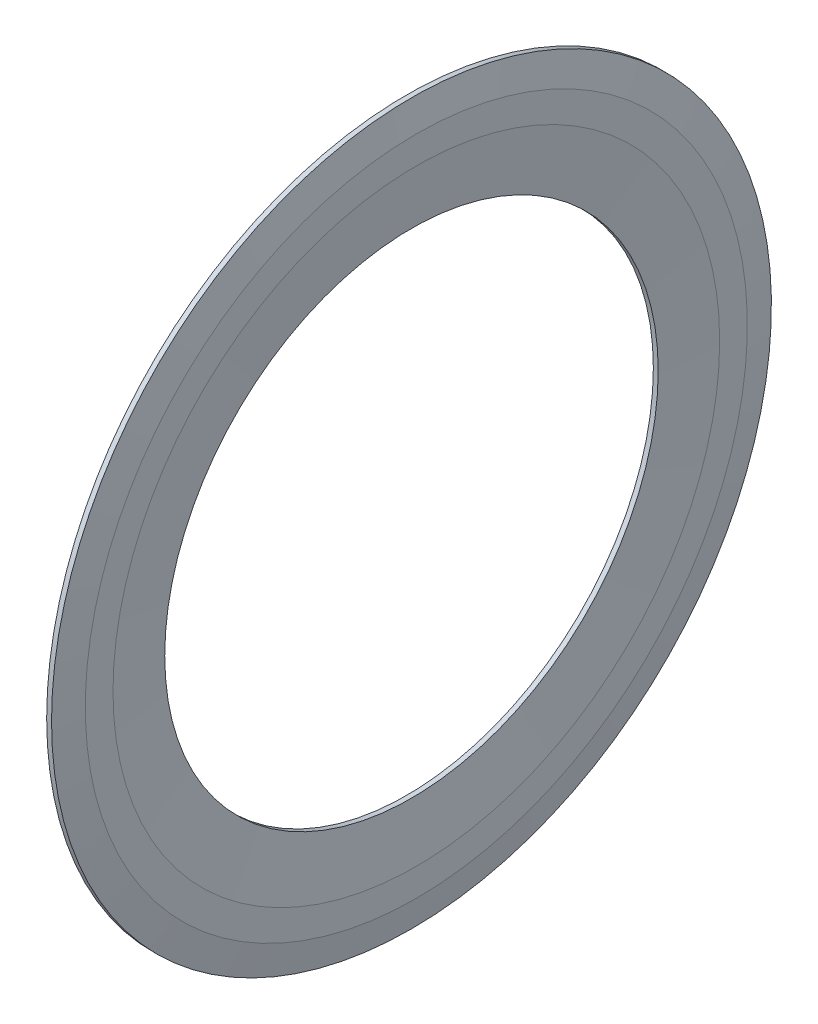
ISO-10303-21;
HEADER;
FILE_DESCRIPTION(('STEP AP214'),'2;1');
FILE_NAME('part.step','',(''),(''),'','','');
FILE_SCHEMA(('AUTOMOTIVE_DESIGN { 1 0 10303 214 1 1 1 1 }'));
ENDSEC;
DATA;
#1=APPLICATION_CONTEXT('core data for automotive mechanical design processes');
#2=APPLICATION_PROTOCOL_DEFINITION('international standard','automotive_design',2000,#1);
#3=PRODUCT_CONTEXT('',#1,'mechanical');
#4=PRODUCT('Part','Part','',(#3));
#5=PRODUCT_RELATED_PRODUCT_CATEGORY('part','',(#4));
#6=PRODUCT_DEFINITION_FORMATION('','',#4);
#7=PRODUCT_DEFINITION_CONTEXT('part definition',#1,'design');
#8=PRODUCT_DEFINITION('design','',#6,#7);
#9=PRODUCT_DEFINITION_SHAPE('','',#8);
#10=(LENGTH_UNIT() NAMED_UNIT(*) SI_UNIT(.MILLI.,.METRE.));
#11=(NAMED_UNIT(*) PLANE_ANGLE_UNIT() SI_UNIT($,.RADIAN.));
#12=(NAMED_UNIT(*) SI_UNIT($,.STERADIAN.) SOLID_ANGLE_UNIT());
#13=UNCERTAINTY_MEASURE_WITH_UNIT(LENGTH_MEASURE(1.E-05),#10,'distance_accuracy_value','');
#14=(GEOMETRIC_REPRESENTATION_CONTEXT(3) GLOBAL_UNCERTAINTY_ASSIGNED_CONTEXT((#13)) GLOBAL_UNIT_ASSIGNED_CONTEXT((#10,
#11,#12)) REPRESENTATION_CONTEXT('',''));
#15=CARTESIAN_POINT('',(0.,0.,0.));
#16=DIRECTION('',(0.,0.,1.));
#17=DIRECTION('',(1.,0.,0.));
#18=AXIS2_PLACEMENT_3D('',#15,#16,#17);
#19=CARTESIAN_POINT('',(0.502281,0.,0.));
#20=DIRECTION('',(-1.,0.,0.));
#21=DIRECTION('',(0.,0.,1.));
#22=AXIS2_PLACEMENT_3D('',#19,#20,#21);
#23=CONICAL_SURFACE('',#22,12.4,1.48513467482621);
#24=CARTESIAN_POINT('',(0.502281,0.,0.));
#25=DIRECTION('',(-1.,0.,0.));
#26=DIRECTION('',(0.,0.,1.));
#27=AXIS2_PLACEMENT_3D('',#24,#25,#26);
#28=CIRCLE('',#27,12.4);
#29=CARTESIAN_POINT('',(0.502281,0.,12.4));
#30=VERTEX_POINT('',#29);
#31=EDGE_CURVE('E40',#30,#30,#28,.F.);
#32=ORIENTED_EDGE('',*,*,#31,.F.);
#33=EDGE_LOOP('',(#32));
#34=FACE_BOUND('',#33,.T.);
#35=CARTESIAN_POINT('',(0.586006,0.,0.));
#36=DIRECTION('',(1.,0.,0.));
#37=DIRECTION('',(0.,0.,-1.));
#38=AXIS2_PLACEMENT_3D('',#35,#36,#37);
#39=CIRCLE('',#38,11.425);
#40=CARTESIAN_POINT('',(0.586006,0.,-11.425));
#41=VERTEX_POINT('',#40);
#42=EDGE_CURVE('E35',#41,#41,#39,.F.);
#43=ORIENTED_EDGE('',*,*,#42,.F.);
#44=EDGE_LOOP('',(#43));
#45=FACE_BOUND('',#44,.T.);
#46=ADVANCED_FACE('F15',(#34,#45),#23,.F.);
#47=CARTESIAN_POINT('',(0.669731,0.,0.));
#48=DIRECTION('',(-1.,0.,0.));
#49=DIRECTION('',(0.,0.,1.));
#50=AXIS2_PLACEMENT_3D('',#47,#48,#49);
#51=CYLINDRICAL_SURFACE('',#50,12.4);
#52=CARTESIAN_POINT('',(0.669731000000009,0.,0.));
#53=DIRECTION('',(-1.,0.,0.));
#54=DIRECTION('',(0.,0.,1.));
#55=AXIS2_PLACEMENT_3D('',#52,#53,#54);
#56=CIRCLE('',#55,12.4);
#57=CARTESIAN_POINT('',(0.669731000000009,0.,12.4));
#58=VERTEX_POINT('',#57);
#59=EDGE_CURVE('E32',#58,#58,#56,.F.);
#60=ORIENTED_EDGE('',*,*,#59,.F.);
#61=EDGE_LOOP('',(#60));
#62=FACE_BOUND('',#61,.T.);
#63=ORIENTED_EDGE('',*,*,#31,.T.);
#64=EDGE_LOOP('',(#63));
#65=FACE_BOUND('',#64,.T.);
#66=ADVANCED_FACE('F61',(#62,#65),#51,.T.);
#67=CARTESIAN_POINT('',(0.586006,0.,0.));
#68=DIRECTION('',(1.,0.,0.));
#69=DIRECTION('',(0.,0.,-1.));
#70=AXIS2_PLACEMENT_3D('',#67,#68,#69);
#71=CONICAL_SURFACE('',#70,11.425,1.48513467482621);
#72=ORIENTED_EDGE('',*,*,#42,.T.);
#73=EDGE_LOOP('',(#72));
#74=FACE_BOUND('',#73,.T.);
#75=CARTESIAN_POINT('',(0.502280999999997,0.,0.));
#76=DIRECTION('',(1.,0.,0.));
#77=DIRECTION('',(0.,0.,-1.));
#78=AXIS2_PLACEMENT_3D('',#75,#76,#77);
#79=CIRCLE('',#78,10.45);
#80=CARTESIAN_POINT('',(0.502280999999997,0.,-10.45));
#81=VERTEX_POINT('',#80);
#82=EDGE_CURVE('E18',#81,#81,#79,.F.);
#83=ORIENTED_EDGE('',*,*,#82,.F.);
#84=EDGE_LOOP('',(#83));
#85=FACE_BOUND('',#84,.T.);
#86=ADVANCED_FACE('F58',(#74,#85),#71,.T.);
#87=CARTESIAN_POINT('',(0.669731000000008,0.,0.));
#88=DIRECTION('',(-1.,0.,0.));
#89=DIRECTION('',(0.,-1.,0.));
#90=AXIS2_PLACEMENT_3D('',#87,#88,#89);
#91=CONICAL_SURFACE('',#90,12.4,1.40432483690449);
#92=CARTESIAN_POINT('',(0.837181,0.,0.));
#93=DIRECTION('',(-1.,0.,0.));
#94=DIRECTION('',(0.,-1.,0.));
#95=AXIS2_PLACEMENT_3D('',#92,#93,#94);
#96=CIRCLE('',#95,11.4034311519231);
#97=CARTESIAN_POINT('',(0.837181,-11.4034311519231,0.));
#98=VERTEX_POINT('',#97);
#99=EDGE_CURVE('E48',#98,#98,#96,.F.);
#100=ORIENTED_EDGE('',*,*,#99,.F.);
#101=EDGE_LOOP('',(#100));
#102=FACE_BOUND('',#101,.T.);
#103=ORIENTED_EDGE('',*,*,#59,.T.);
#104=EDGE_LOOP('',(#103));
#105=FACE_BOUND('',#104,.T.);
#106=ADVANCED_FACE('F60',(#102,#105),#91,.T.);
#107=CARTESIAN_POINT('',(0.502281,10.45,0.));
#108=DIRECTION('',(-1.,0.,0.));
#109=DIRECTION('',(0.,0.,1.));
#110=AXIS2_PLACEMENT_3D('',#107,#108,#109);
#111=PLANE('',#110);
#112=ORIENTED_EDGE('',*,*,#82,.T.);
#113=EDGE_LOOP('',(#112));
#114=FACE_BOUND('',#113,.T.);
#115=CARTESIAN_POINT('',(0.502281,0.,0.));
#116=DIRECTION('',(-1.,0.,0.));
#117=DIRECTION('',(0.,0.,1.));
#118=AXIS2_PLACEMENT_3D('',#115,#116,#117);
#119=CIRCLE('',#118,8.5);
#120=CARTESIAN_POINT('',(0.502281,0.,8.5));
#121=VERTEX_POINT('',#120);
#122=EDGE_CURVE('E27',#121,#121,#119,.F.);
#123=ORIENTED_EDGE('',*,*,#122,.T.);
#124=EDGE_LOOP('',(#123));
#125=FACE_BOUND('',#124,.T.);
#126=ADVANCED_FACE('F55',(#114,#125),#111,.T.);
#127=CARTESIAN_POINT('',(0.837181,10.45,0.));
#128=DIRECTION('',(1.,0.,0.));
#129=DIRECTION('',(0.,0.,-1.));
#130=AXIS2_PLACEMENT_3D('',#127,#128,#129);
#131=PLANE('',#130);
#132=CARTESIAN_POINT('',(0.837181000000006,0.,0.));
#133=DIRECTION('',(1.,0.,0.));
#134=DIRECTION('',(0.,0.,-1.));
#135=AXIS2_PLACEMENT_3D('',#132,#133,#134);
#136=CIRCLE('',#135,10.45);
#137=CARTESIAN_POINT('',(0.837181000000006,0.,-10.45));
#138=VERTEX_POINT('',#137);
#139=EDGE_CURVE('E22',#138,#138,#136,.F.);
#140=ORIENTED_EDGE('',*,*,#139,.T.);
#141=EDGE_LOOP('',(#140));
#142=FACE_BOUND('',#141,.T.);
#143=ORIENTED_EDGE('',*,*,#99,.T.);
#144=EDGE_LOOP('',(#143));
#145=FACE_BOUND('',#144,.T.);
#146=ADVANCED_FACE('F80',(#142,#145),#131,.T.);
#147=CARTESIAN_POINT('',(0.669731,0.,0.));
#148=DIRECTION('',(-1.,0.,0.));
#149=DIRECTION('',(0.,0.,1.));
#150=AXIS2_PLACEMENT_3D('',#147,#148,#149);
#151=CYLINDRICAL_SURFACE('',#150,8.5);
#152=ORIENTED_EDGE('',*,*,#122,.F.);
#153=EDGE_LOOP('',(#152));
#154=FACE_BOUND('',#153,.T.);
#155=CARTESIAN_POINT('',(0.669731,0.,0.));
#156=DIRECTION('',(1.,0.,0.));
#157=DIRECTION('',(0.,0.,-1.));
#158=AXIS2_PLACEMENT_3D('',#155,#156,#157);
#159=CIRCLE('',#158,8.5);
#160=CARTESIAN_POINT('',(0.669731,0.,-8.5));
#161=VERTEX_POINT('',#160);
#162=EDGE_CURVE('E10',#161,#161,#159,.T.);
#163=ORIENTED_EDGE('',*,*,#162,.T.);
#164=EDGE_LOOP('',(#163));
#165=FACE_BOUND('',#164,.T.);
#166=ADVANCED_FACE('F74',(#154,#165),#151,.F.);
#167=CARTESIAN_POINT('',(0.837181000000006,0.,0.));
#168=DIRECTION('',(1.,0.,0.));
#169=DIRECTION('',(0.,0.,-1.));
#170=AXIS2_PLACEMENT_3D('',#167,#168,#169);
#171=CONICAL_SURFACE('',#170,10.45,1.48513467482621);
#172=ORIENTED_EDGE('',*,*,#162,.F.);
#173=EDGE_LOOP('',(#172));
#174=FACE_BOUND('',#173,.T.);
#175=ORIENTED_EDGE('',*,*,#139,.F.);
#176=EDGE_LOOP('',(#175));
#177=FACE_BOUND('',#176,.T.);
#178=ADVANCED_FACE('F72',(#174,#177),#171,.F.);
#179=CLOSED_SHELL('',(#46,#66,#86,#106,#126,#146,#166,#178));
#180=MANIFOLD_SOLID_BREP('B1',#179);
#181=ADVANCED_BREP_SHAPE_REPRESENTATION('',(#18,#180),#14);
#182=SHAPE_DEFINITION_REPRESENTATION(#9,#181);
ENDSEC;
END-ISO-10303-21;
